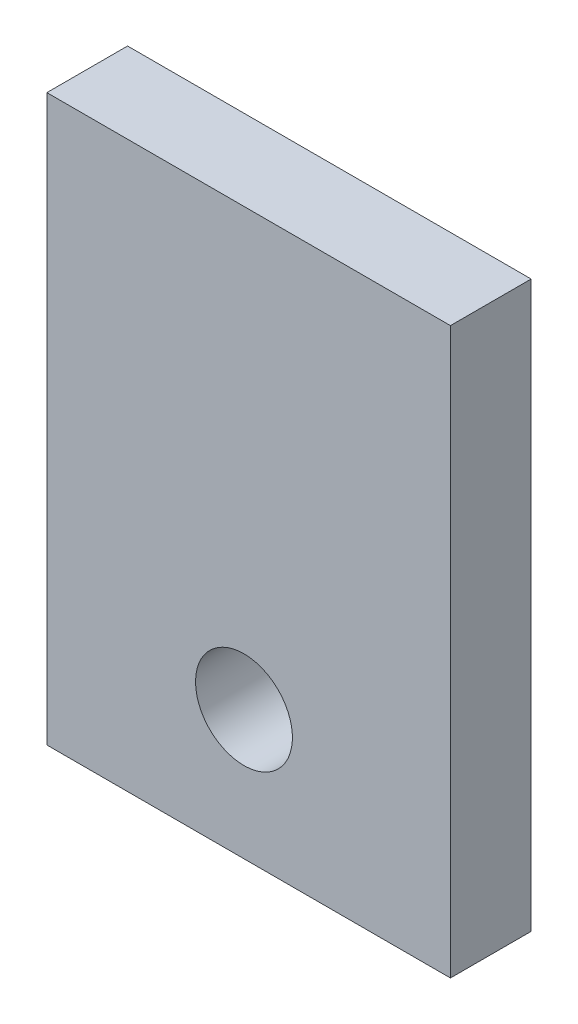
ISO-10303-21;
HEADER;
FILE_DESCRIPTION(('STEP AP214'),'2;1');
FILE_NAME('part.step','',(''),(''),'','','');
FILE_SCHEMA(('AUTOMOTIVE_DESIGN { 1 0 10303 214 1 1 1 1 }'));
ENDSEC;
DATA;
#1=APPLICATION_CONTEXT('core data for automotive mechanical design processes');
#2=APPLICATION_PROTOCOL_DEFINITION('international standard','automotive_design',2000,#1);
#3=PRODUCT_CONTEXT('',#1,'mechanical');
#4=PRODUCT('Part','Part','',(#3));
#5=PRODUCT_RELATED_PRODUCT_CATEGORY('part','',(#4));
#6=PRODUCT_DEFINITION_FORMATION('','',#4);
#7=PRODUCT_DEFINITION_CONTEXT('part definition',#1,'design');
#8=PRODUCT_DEFINITION('design','',#6,#7);
#9=PRODUCT_DEFINITION_SHAPE('','',#8);
#10=(LENGTH_UNIT() NAMED_UNIT(*) SI_UNIT(.MILLI.,.METRE.));
#11=(NAMED_UNIT(*) PLANE_ANGLE_UNIT() SI_UNIT($,.RADIAN.));
#12=(NAMED_UNIT(*) SI_UNIT($,.STERADIAN.) SOLID_ANGLE_UNIT());
#13=UNCERTAINTY_MEASURE_WITH_UNIT(LENGTH_MEASURE(1.E-05),#10,'distance_accuracy_value','');
#14=(GEOMETRIC_REPRESENTATION_CONTEXT(3) GLOBAL_UNCERTAINTY_ASSIGNED_CONTEXT((#13)) GLOBAL_UNIT_ASSIGNED_CONTEXT((#10,
#11,#12)) REPRESENTATION_CONTEXT('',''));
#15=CARTESIAN_POINT('',(0.,0.,0.));
#16=DIRECTION('',(0.,0.,1.));
#17=DIRECTION('',(1.,0.,0.));
#18=AXIS2_PLACEMENT_3D('',#15,#16,#17);
#19=CARTESIAN_POINT('',(0.,0.,2.));
#20=DIRECTION('',(1.,0.,0.));
#21=DIRECTION('',(0.,1.,0.));
#22=AXIS2_PLACEMENT_3D('',#19,#20,#21);
#23=PLANE('',#22);
#24=DIRECTION('',(0.,-1.,0.));
#25=VECTOR('',#24,1.);
#26=CARTESIAN_POINT('',(0.,0.,0.));
#27=LINE('',#26,#25);
#28=CARTESIAN_POINT('',(0.,0.,0.));
#29=VERTEX_POINT('',#28);
#30=CARTESIAN_POINT('',(0.,-10.,0.));
#31=VERTEX_POINT('',#30);
#32=EDGE_CURVE('E141',#29,#31,#27,.T.);
#33=ORIENTED_EDGE('',*,*,#32,.T.);
#34=DIRECTION('',(0.,0.,-1.));
#35=VECTOR('',#34,1.);
#36=CARTESIAN_POINT('',(0.,-10.,2.));
#37=LINE('',#36,#35);
#38=CARTESIAN_POINT('',(0.,-10.,2.));
#39=VERTEX_POINT('',#38);
#40=EDGE_CURVE('E11',#39,#31,#37,.T.);
#41=ORIENTED_EDGE('',*,*,#40,.F.);
#42=DIRECTION('',(0.,-1.,0.));
#43=VECTOR('',#42,1.);
#44=CARTESIAN_POINT('',(0.,0.,2.));
#45=LINE('',#44,#43);
#46=CARTESIAN_POINT('',(0.,0.,2.));
#47=VERTEX_POINT('',#46);
#48=EDGE_CURVE('E152',#47,#39,#45,.T.);
#49=ORIENTED_EDGE('',*,*,#48,.F.);
#50=DIRECTION('',(0.,0.,-1.));
#51=VECTOR('',#50,1.);
#52=CARTESIAN_POINT('',(0.,0.,2.));
#53=LINE('',#52,#51);
#54=EDGE_CURVE('E165',#47,#29,#53,.T.);
#55=ORIENTED_EDGE('',*,*,#54,.T.);
#56=EDGE_LOOP('',(#33,#41,#49,#55));
#57=FACE_BOUND('',#56,.T.);
#58=ADVANCED_FACE('F39',(#57),#23,.F.);
#59=CARTESIAN_POINT('',(0.,-10.,2.));
#60=DIRECTION('',(0.,1.,0.));
#61=DIRECTION('',(0.,0.,1.));
#62=AXIS2_PLACEMENT_3D('',#59,#60,#61);
#63=PLANE('',#62);
#64=DIRECTION('',(1.,0.,0.));
#65=VECTOR('',#64,1.);
#66=CARTESIAN_POINT('',(0.,-10.,0.));
#67=LINE('',#66,#65);
#68=CARTESIAN_POINT('',(12.,-10.,0.));
#69=VERTEX_POINT('',#68);
#70=EDGE_CURVE('E146',#31,#69,#67,.T.);
#71=ORIENTED_EDGE('',*,*,#70,.T.);
#72=DIRECTION('',(0.,0.,-1.));
#73=VECTOR('',#72,1.);
#74=CARTESIAN_POINT('',(12.,-10.,2.));
#75=LINE('',#74,#73);
#76=CARTESIAN_POINT('',(12.,-10.,2.));
#77=VERTEX_POINT('',#76);
#78=EDGE_CURVE('E48',#77,#69,#75,.T.);
#79=ORIENTED_EDGE('',*,*,#78,.F.);
#80=DIRECTION('',(1.,0.,0.));
#81=VECTOR('',#80,1.);
#82=CARTESIAN_POINT('',(0.,-10.,2.));
#83=LINE('',#82,#81);
#84=EDGE_CURVE('E82',#39,#77,#83,.T.);
#85=ORIENTED_EDGE('',*,*,#84,.F.);
#86=ORIENTED_EDGE('',*,*,#40,.T.);
#87=EDGE_LOOP('',(#71,#79,#85,#86));
#88=FACE_BOUND('',#87,.T.);
#89=ADVANCED_FACE('F199',(#88),#63,.F.);
#90=CARTESIAN_POINT('',(12.,0.,2.));
#91=DIRECTION('',(-1.,0.,0.));
#92=DIRECTION('',(0.,-1.,0.));
#93=AXIS2_PLACEMENT_3D('',#90,#91,#92);
#94=PLANE('',#93);
#95=DIRECTION('',(0.,1.,0.));
#96=VECTOR('',#95,1.);
#97=CARTESIAN_POINT('',(12.,0.,0.));
#98=LINE('',#97,#96);
#99=CARTESIAN_POINT('',(12.,0.,0.));
#100=VERTEX_POINT('',#99);
#101=EDGE_CURVE('E72',#69,#100,#98,.T.);
#102=ORIENTED_EDGE('',*,*,#101,.T.);
#103=DIRECTION('',(0.,0.,-1.));
#104=VECTOR('',#103,1.);
#105=CARTESIAN_POINT('',(12.,0.,2.));
#106=LINE('',#105,#104);
#107=CARTESIAN_POINT('',(12.,0.,2.));
#108=VERTEX_POINT('',#107);
#109=EDGE_CURVE('E56',#108,#100,#106,.T.);
#110=ORIENTED_EDGE('',*,*,#109,.F.);
#111=DIRECTION('',(0.,1.,0.));
#112=VECTOR('',#111,1.);
#113=CARTESIAN_POINT('',(12.,0.,2.));
#114=LINE('',#113,#112);
#115=EDGE_CURVE('E158',#77,#108,#114,.T.);
#116=ORIENTED_EDGE('',*,*,#115,.F.);
#117=ORIENTED_EDGE('',*,*,#78,.T.);
#118=EDGE_LOOP('',(#102,#110,#116,#117));
#119=FACE_BOUND('',#118,.T.);
#120=ADVANCED_FACE('F177',(#119),#94,.F.);
#121=CARTESIAN_POINT('',(0.,0.,2.));
#122=DIRECTION('',(0.,-1.,0.));
#123=DIRECTION('',(0.,0.,-1.));
#124=AXIS2_PLACEMENT_3D('',#121,#122,#123);
#125=PLANE('',#124);
#126=DIRECTION('',(-1.,0.,0.));
#127=VECTOR('',#126,1.);
#128=CARTESIAN_POINT('',(0.,0.,0.));
#129=LINE('',#128,#127);
#130=EDGE_CURVE('E77',#100,#29,#129,.T.);
#131=ORIENTED_EDGE('',*,*,#130,.T.);
#132=ORIENTED_EDGE('',*,*,#54,.F.);
#133=DIRECTION('',(-1.,0.,0.));
#134=VECTOR('',#133,1.);
#135=CARTESIAN_POINT('',(0.,0.,2.));
#136=LINE('',#135,#134);
#137=EDGE_CURVE('E162',#108,#47,#136,.T.);
#138=ORIENTED_EDGE('',*,*,#137,.F.);
#139=ORIENTED_EDGE('',*,*,#109,.T.);
#140=EDGE_LOOP('',(#131,#132,#138,#139));
#141=FACE_BOUND('',#140,.T.);
#142=ADVANCED_FACE('F182',(#141),#125,.F.);
#143=CARTESIAN_POINT('',(0.,0.,0.));
#144=DIRECTION('',(0.,0.,1.));
#145=DIRECTION('',(1.,0.,0.));
#146=AXIS2_PLACEMENT_3D('',#143,#144,#145);
#147=PLANE('',#146);
#148=ORIENTED_EDGE('',*,*,#32,.F.);
#149=ORIENTED_EDGE('',*,*,#130,.F.);
#150=ORIENTED_EDGE('',*,*,#101,.F.);
#151=ORIENTED_EDGE('',*,*,#70,.F.);
#152=EDGE_LOOP('',(#148,#149,#150,#151));
#153=FACE_BOUND('',#152,.T.);
#154=ADVANCED_FACE('F180',(#153),#147,.F.);
#155=CARTESIAN_POINT('',(0.,0.,2.));
#156=DIRECTION('',(0.,0.,1.));
#157=DIRECTION('',(1.,0.,0.));
#158=AXIS2_PLACEMENT_3D('',#155,#156,#157);
#159=PLANE('',#158);
#160=CARTESIAN_POINT('',(5.10839027537464,-17.,2.));
#161=DIRECTION('',(0.,0.,1.));
#162=DIRECTION('',(1.,0.,0.));
#163=AXIS2_PLACEMENT_3D('',#160,#161,#162);
#164=CIRCLE('',#163,3.);
#165=CARTESIAN_POINT('',(8.10839027537465,-17.,2.));
#166=VERTEX_POINT('',#165);
#167=EDGE_CURVE('E235',#166,#166,#164,.T.);
#168=ORIENTED_EDGE('',*,*,#167,.T.);
#169=EDGE_LOOP('',(#168));
#170=FACE_BOUND('',#169,.T.);
#171=DIRECTION('',(0.,-1.,0.));
#172=VECTOR('',#171,1.);
#173=CARTESIAN_POINT('',(-7.10176207996938,10.,2.));
#174=LINE('',#173,#172);
#175=CARTESIAN_POINT('',(-7.10176207996938,10.,2.));
#176=VERTEX_POINT('',#175);
#177=CARTESIAN_POINT('',(-7.10176207996937,-25.,2.));
#178=VERTEX_POINT('',#177);
#179=EDGE_CURVE('E139',#176,#178,#174,.T.);
#180=ORIENTED_EDGE('',*,*,#179,.F.);
#181=DIRECTION('',(-1.,0.,0.));
#182=VECTOR('',#181,1.);
#183=CARTESIAN_POINT('',(-7.10176207996938,10.,2.));
#184=LINE('',#183,#182);
#185=CARTESIAN_POINT('',(17.8982379200306,10.,2.));
#186=VERTEX_POINT('',#185);
#187=EDGE_CURVE('E135',#186,#176,#184,.T.);
#188=ORIENTED_EDGE('',*,*,#187,.F.);
#189=DIRECTION('',(0.,1.,0.));
#190=VECTOR('',#189,1.);
#191=CARTESIAN_POINT('',(17.8982379200306,10.,2.));
#192=LINE('',#191,#190);
#193=CARTESIAN_POINT('',(17.8982379200306,-25.,2.));
#194=VERTEX_POINT('',#193);
#195=EDGE_CURVE('E229',#194,#186,#192,.T.);
#196=ORIENTED_EDGE('',*,*,#195,.F.);
#197=DIRECTION('',(1.,0.,0.));
#198=VECTOR('',#197,1.);
#199=CARTESIAN_POINT('',(-7.10176207996937,-25.,2.));
#200=LINE('',#199,#198);
#201=EDGE_CURVE('E233',#178,#194,#200,.T.);
#202=ORIENTED_EDGE('',*,*,#201,.F.);
#203=EDGE_LOOP('',(#180,#188,#196,#202));
#204=FACE_BOUND('',#203,.T.);
#205=ORIENTED_EDGE('',*,*,#137,.T.);
#206=ORIENTED_EDGE('',*,*,#48,.T.);
#207=ORIENTED_EDGE('',*,*,#84,.T.);
#208=ORIENTED_EDGE('',*,*,#115,.T.);
#209=EDGE_LOOP('',(#205,#206,#207,#208));
#210=FACE_BOUND('',#209,.T.);
#211=ADVANCED_FACE('F184',(#170,#204,#210),#159,.F.);
#212=CARTESIAN_POINT('',(-7.10176207996938,10.,7.));
#213=DIRECTION('',(1.,0.,0.));
#214=DIRECTION('',(0.,1.,0.));
#215=AXIS2_PLACEMENT_3D('',#212,#213,#214);
#216=PLANE('',#215);
#217=ORIENTED_EDGE('',*,*,#179,.T.);
#218=DIRECTION('',(0.,0.,-1.));
#219=VECTOR('',#218,1.);
#220=CARTESIAN_POINT('',(-7.10176207996937,-25.,7.));
#221=LINE('',#220,#219);
#222=CARTESIAN_POINT('',(-7.10176207996937,-25.,7.));
#223=VERTEX_POINT('',#222);
#224=EDGE_CURVE('E117',#223,#178,#221,.T.);
#225=ORIENTED_EDGE('',*,*,#224,.F.);
#226=DIRECTION('',(0.,-1.,0.));
#227=VECTOR('',#226,1.);
#228=CARTESIAN_POINT('',(-7.10176207996938,10.,7.));
#229=LINE('',#228,#227);
#230=CARTESIAN_POINT('',(-7.10176207996938,10.,7.));
#231=VERTEX_POINT('',#230);
#232=EDGE_CURVE('E125',#231,#223,#229,.T.);
#233=ORIENTED_EDGE('',*,*,#232,.F.);
#234=DIRECTION('',(0.,0.,-1.));
#235=VECTOR('',#234,1.);
#236=CARTESIAN_POINT('',(-7.10176207996938,10.,7.));
#237=LINE('',#236,#235);
#238=EDGE_CURVE('E225',#231,#176,#237,.T.);
#239=ORIENTED_EDGE('',*,*,#238,.T.);
#240=EDGE_LOOP('',(#217,#225,#233,#239));
#241=FACE_BOUND('',#240,.T.);
#242=ADVANCED_FACE('F137',(#241),#216,.F.);
#243=CARTESIAN_POINT('',(-7.10176207996937,-25.,7.));
#244=DIRECTION('',(0.,1.,0.));
#245=DIRECTION('',(0.,0.,1.));
#246=AXIS2_PLACEMENT_3D('',#243,#244,#245);
#247=PLANE('',#246);
#248=ORIENTED_EDGE('',*,*,#201,.T.);
#249=DIRECTION('',(0.,0.,-1.));
#250=VECTOR('',#249,1.);
#251=CARTESIAN_POINT('',(17.8982379200306,-25.,7.));
#252=LINE('',#251,#250);
#253=CARTESIAN_POINT('',(17.8982379200306,-25.,7.));
#254=VERTEX_POINT('',#253);
#255=EDGE_CURVE('E120',#254,#194,#252,.T.);
#256=ORIENTED_EDGE('',*,*,#255,.F.);
#257=DIRECTION('',(1.,0.,0.));
#258=VECTOR('',#257,1.);
#259=CARTESIAN_POINT('',(-7.10176207996937,-25.,7.));
#260=LINE('',#259,#258);
#261=EDGE_CURVE('E113',#223,#254,#260,.T.);
#262=ORIENTED_EDGE('',*,*,#261,.F.);
#263=ORIENTED_EDGE('',*,*,#224,.T.);
#264=EDGE_LOOP('',(#248,#256,#262,#263));
#265=FACE_BOUND('',#264,.T.);
#266=ADVANCED_FACE('F115',(#265),#247,.F.);
#267=CARTESIAN_POINT('',(17.8982379200306,10.,7.));
#268=DIRECTION('',(-1.,0.,0.));
#269=DIRECTION('',(0.,-1.,0.));
#270=AXIS2_PLACEMENT_3D('',#267,#268,#269);
#271=PLANE('',#270);
#272=ORIENTED_EDGE('',*,*,#195,.T.);
#273=DIRECTION('',(0.,0.,-1.));
#274=VECTOR('',#273,1.);
#275=CARTESIAN_POINT('',(17.8982379200306,10.,7.));
#276=LINE('',#275,#274);
#277=CARTESIAN_POINT('',(17.8982379200306,10.,7.));
#278=VERTEX_POINT('',#277);
#279=EDGE_CURVE('E148',#278,#186,#276,.T.);
#280=ORIENTED_EDGE('',*,*,#279,.F.);
#281=DIRECTION('',(0.,1.,0.));
#282=VECTOR('',#281,1.);
#283=CARTESIAN_POINT('',(17.8982379200306,10.,7.));
#284=LINE('',#283,#282);
#285=EDGE_CURVE('E124',#254,#278,#284,.T.);
#286=ORIENTED_EDGE('',*,*,#285,.F.);
#287=ORIENTED_EDGE('',*,*,#255,.T.);
#288=EDGE_LOOP('',(#272,#280,#286,#287));
#289=FACE_BOUND('',#288,.T.);
#290=ADVANCED_FACE('F212',(#289),#271,.F.);
#291=CARTESIAN_POINT('',(-7.10176207996938,10.,7.));
#292=DIRECTION('',(0.,-1.,0.));
#293=DIRECTION('',(1.,0.,0.));
#294=AXIS2_PLACEMENT_3D('',#291,#292,#293);
#295=PLANE('',#294);
#296=ORIENTED_EDGE('',*,*,#187,.T.);
#297=ORIENTED_EDGE('',*,*,#238,.F.);
#298=DIRECTION('',(-1.,0.,0.));
#299=VECTOR('',#298,1.);
#300=CARTESIAN_POINT('',(-7.10176207996938,10.,7.));
#301=LINE('',#300,#299);
#302=EDGE_CURVE('E130',#278,#231,#301,.T.);
#303=ORIENTED_EDGE('',*,*,#302,.F.);
#304=ORIENTED_EDGE('',*,*,#279,.T.);
#305=EDGE_LOOP('',(#296,#297,#303,#304));
#306=FACE_BOUND('',#305,.T.);
#307=ADVANCED_FACE('F214',(#306),#295,.F.);
#308=CARTESIAN_POINT('',(0.,0.,7.));
#309=DIRECTION('',(0.,0.,1.));
#310=DIRECTION('',(1.,0.,0.));
#311=AXIS2_PLACEMENT_3D('',#308,#309,#310);
#312=PLANE('',#311);
#313=CARTESIAN_POINT('',(5.10839027537464,-17.,7.));
#314=DIRECTION('',(0.,0.,-1.));
#315=DIRECTION('',(-1.,0.,0.));
#316=AXIS2_PLACEMENT_3D('',#313,#314,#315);
#317=CIRCLE('',#316,3.);
#318=CARTESIAN_POINT('',(2.10839027537464,-17.,7.));
#319=VERTEX_POINT('',#318);
#320=EDGE_CURVE('E240',#319,#319,#317,.T.);
#321=ORIENTED_EDGE('',*,*,#320,.T.);
#322=EDGE_LOOP('',(#321));
#323=FACE_BOUND('',#322,.T.);
#324=ORIENTED_EDGE('',*,*,#232,.T.);
#325=ORIENTED_EDGE('',*,*,#261,.T.);
#326=ORIENTED_EDGE('',*,*,#285,.T.);
#327=ORIENTED_EDGE('',*,*,#302,.T.);
#328=EDGE_LOOP('',(#324,#325,#326,#327));
#329=FACE_BOUND('',#328,.T.);
#330=ADVANCED_FACE('F128',(#323,#329),#312,.T.);
#331=CARTESIAN_POINT('',(5.10839027537464,-17.,7.));
#332=DIRECTION('',(0.,0.,-1.));
#333=DIRECTION('',(-1.,0.,0.));
#334=AXIS2_PLACEMENT_3D('',#331,#332,#333);
#335=CYLINDRICAL_SURFACE('',#334,3.);
#336=ORIENTED_EDGE('',*,*,#320,.F.);
#337=EDGE_LOOP('',(#336));
#338=FACE_BOUND('',#337,.T.);
#339=ORIENTED_EDGE('',*,*,#167,.F.);
#340=EDGE_LOOP('',(#339));
#341=FACE_BOUND('',#340,.T.);
#342=ADVANCED_FACE('F221',(#338,#341),#335,.F.);
#343=CLOSED_SHELL('',(#58,#89,#120,#142,#154,#211,#242,#266,#290,#307,#330,#342));
#344=MANIFOLD_SOLID_BREP('B2',#343);
#345=ADVANCED_BREP_SHAPE_REPRESENTATION('',(#18,#344),#14);
#346=SHAPE_DEFINITION_REPRESENTATION(#9,#345);
ENDSEC;
END-ISO-10303-21;
